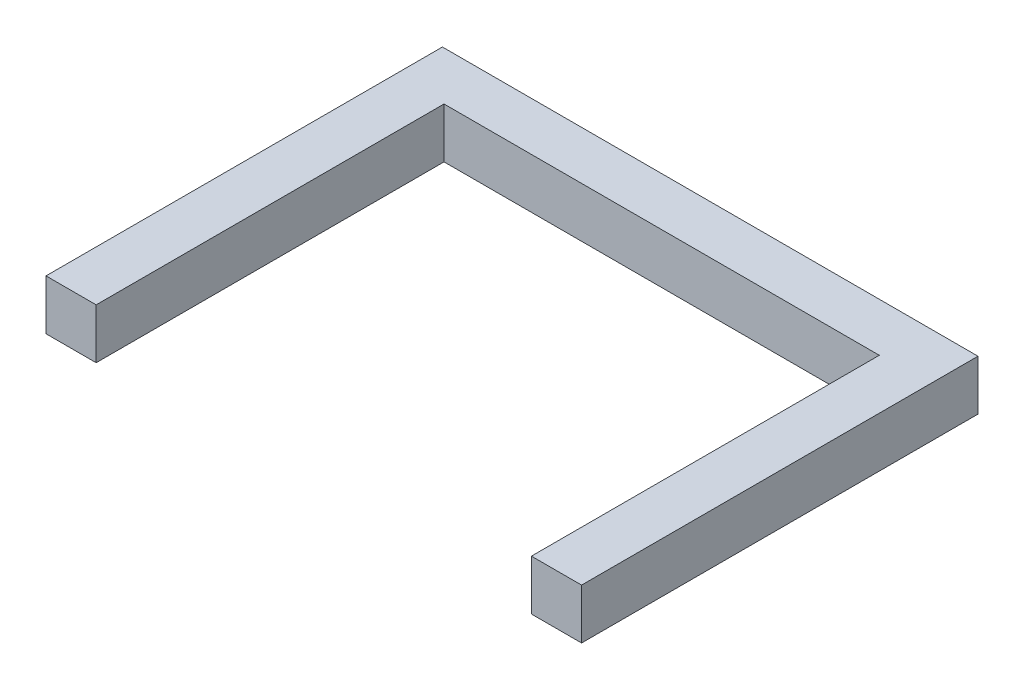
ISO-10303-21;
HEADER;
FILE_DESCRIPTION(('STEP AP214'),'2;1');
FILE_NAME('part.step','',(''),(''),'','','');
FILE_SCHEMA(('AUTOMOTIVE_DESIGN { 1 0 10303 214 1 1 1 1 }'));
ENDSEC;
DATA;
#1=APPLICATION_CONTEXT('core data for automotive mechanical design processes');
#2=APPLICATION_PROTOCOL_DEFINITION('international standard','automotive_design',2000,#1);
#3=PRODUCT_CONTEXT('',#1,'mechanical');
#4=PRODUCT('Part','Part','',(#3));
#5=PRODUCT_RELATED_PRODUCT_CATEGORY('part','',(#4));
#6=PRODUCT_DEFINITION_FORMATION('','',#4);
#7=PRODUCT_DEFINITION_CONTEXT('part definition',#1,'design');
#8=PRODUCT_DEFINITION('design','',#6,#7);
#9=PRODUCT_DEFINITION_SHAPE('','',#8);
#10=(LENGTH_UNIT() NAMED_UNIT(*) SI_UNIT(.MILLI.,.METRE.));
#11=(NAMED_UNIT(*) PLANE_ANGLE_UNIT() SI_UNIT($,.RADIAN.));
#12=(NAMED_UNIT(*) SI_UNIT($,.STERADIAN.) SOLID_ANGLE_UNIT());
#13=UNCERTAINTY_MEASURE_WITH_UNIT(LENGTH_MEASURE(1.E-05),#10,'distance_accuracy_value','');
#14=(GEOMETRIC_REPRESENTATION_CONTEXT(3) GLOBAL_UNCERTAINTY_ASSIGNED_CONTEXT((#13)) GLOBAL_UNIT_ASSIGNED_CONTEXT((#10,
#11,#12)) REPRESENTATION_CONTEXT('',''));
#15=CARTESIAN_POINT('',(0.,0.,0.));
#16=DIRECTION('',(0.,0.,1.));
#17=DIRECTION('',(1.,0.,0.));
#18=AXIS2_PLACEMENT_3D('',#15,#16,#17);
#19=CARTESIAN_POINT('',(3.1,3.1,0.));
#20=DIRECTION('',(0.,0.,-1.));
#21=DIRECTION('',(-1.,0.,0.));
#22=AXIS2_PLACEMENT_3D('',#19,#20,#21);
#23=PLANE('',#22);
#24=DIRECTION('',(1.,0.,0.));
#25=VECTOR('',#24,1.);
#26=CARTESIAN_POINT('',(3.1,0.,0.));
#27=LINE('',#26,#25);
#28=CARTESIAN_POINT('',(0.,0.,0.));
#29=VERTEX_POINT('',#28);
#30=CARTESIAN_POINT('',(3.1,0.,0.));
#31=VERTEX_POINT('',#30);
#32=EDGE_CURVE('E133',#29,#31,#27,.T.);
#33=ORIENTED_EDGE('',*,*,#32,.T.);
#34=DIRECTION('',(0.,-1.,0.));
#35=VECTOR('',#34,1.);
#36=CARTESIAN_POINT('',(3.1,3.1,0.));
#37=LINE('',#36,#35);
#38=CARTESIAN_POINT('',(3.1,3.1,0.));
#39=VERTEX_POINT('',#38);
#40=EDGE_CURVE('E11',#39,#31,#37,.T.);
#41=ORIENTED_EDGE('',*,*,#40,.F.);
#42=DIRECTION('',(1.,0.,0.));
#43=VECTOR('',#42,1.);
#44=CARTESIAN_POINT('',(3.1,3.1,0.));
#45=LINE('',#44,#43);
#46=CARTESIAN_POINT('',(0.,3.1,0.));
#47=VERTEX_POINT('',#46);
#48=EDGE_CURVE('E147',#47,#39,#45,.T.);
#49=ORIENTED_EDGE('',*,*,#48,.F.);
#50=DIRECTION('',(0.,-1.,0.));
#51=VECTOR('',#50,1.);
#52=CARTESIAN_POINT('',(0.,3.1,0.));
#53=LINE('',#52,#51);
#54=EDGE_CURVE('E129',#47,#29,#53,.T.);
#55=ORIENTED_EDGE('',*,*,#54,.T.);
#56=EDGE_LOOP('',(#33,#41,#49,#55));
#57=FACE_BOUND('',#56,.T.);
#58=ADVANCED_FACE('F37',(#57),#23,.F.);
#59=CARTESIAN_POINT('',(3.1,3.1,-21.5));
#60=DIRECTION('',(-1.,0.,0.));
#61=DIRECTION('',(0.,0.,1.));
#62=AXIS2_PLACEMENT_3D('',#59,#60,#61);
#63=PLANE('',#62);
#64=DIRECTION('',(0.,0.,-1.));
#65=VECTOR('',#64,1.);
#66=CARTESIAN_POINT('',(3.1,0.,-21.5));
#67=LINE('',#66,#65);
#68=CARTESIAN_POINT('',(3.1,0.,-21.5));
#69=VERTEX_POINT('',#68);
#70=EDGE_CURVE('E136',#31,#69,#67,.T.);
#71=ORIENTED_EDGE('',*,*,#70,.T.);
#72=DIRECTION('',(0.,-1.,0.));
#73=VECTOR('',#72,1.);
#74=CARTESIAN_POINT('',(3.1,3.1,-21.5));
#75=LINE('',#74,#73);
#76=CARTESIAN_POINT('',(3.1,3.1,-21.5));
#77=VERTEX_POINT('',#76);
#78=EDGE_CURVE('E45',#77,#69,#75,.T.);
#79=ORIENTED_EDGE('',*,*,#78,.F.);
#80=DIRECTION('',(0.,0.,-1.));
#81=VECTOR('',#80,1.);
#82=CARTESIAN_POINT('',(3.1,3.1,-21.5));
#83=LINE('',#82,#81);
#84=EDGE_CURVE('E96',#39,#77,#83,.T.);
#85=ORIENTED_EDGE('',*,*,#84,.F.);
#86=ORIENTED_EDGE('',*,*,#40,.T.);
#87=EDGE_LOOP('',(#71,#79,#85,#86));
#88=FACE_BOUND('',#87,.T.);
#89=ADVANCED_FACE('F182',(#88),#63,.F.);
#90=CARTESIAN_POINT('',(30.,3.1,-21.5));
#91=DIRECTION('',(0.,0.,-1.));
#92=DIRECTION('',(-1.,0.,0.));
#93=AXIS2_PLACEMENT_3D('',#90,#91,#92);
#94=PLANE('',#93);
#95=DIRECTION('',(1.,0.,0.));
#96=VECTOR('',#95,1.);
#97=CARTESIAN_POINT('',(30.,0.,-21.5));
#98=LINE('',#97,#96);
#99=CARTESIAN_POINT('',(30.,0.,-21.5));
#100=VERTEX_POINT('',#99);
#101=EDGE_CURVE('E138',#69,#100,#98,.T.);
#102=ORIENTED_EDGE('',*,*,#101,.T.);
#103=DIRECTION('',(0.,-1.,0.));
#104=VECTOR('',#103,1.);
#105=CARTESIAN_POINT('',(30.,3.1,-21.5));
#106=LINE('',#105,#104);
#107=CARTESIAN_POINT('',(30.,3.1,-21.5));
#108=VERTEX_POINT('',#107);
#109=EDGE_CURVE('E154',#108,#100,#106,.T.);
#110=ORIENTED_EDGE('',*,*,#109,.F.);
#111=DIRECTION('',(1.,0.,0.));
#112=VECTOR('',#111,1.);
#113=CARTESIAN_POINT('',(30.,3.1,-21.5));
#114=LINE('',#113,#112);
#115=EDGE_CURVE('E162',#77,#108,#114,.T.);
#116=ORIENTED_EDGE('',*,*,#115,.F.);
#117=ORIENTED_EDGE('',*,*,#78,.T.);
#118=EDGE_LOOP('',(#102,#110,#116,#117));
#119=FACE_BOUND('',#118,.T.);
#120=ADVANCED_FACE('F160',(#119),#94,.F.);
#121=CARTESIAN_POINT('',(30.,3.1,0.));
#122=DIRECTION('',(1.,0.,0.));
#123=DIRECTION('',(0.,0.,-1.));
#124=AXIS2_PLACEMENT_3D('',#121,#122,#123);
#125=PLANE('',#124);
#126=DIRECTION('',(0.,0.,1.));
#127=VECTOR('',#126,1.);
#128=CARTESIAN_POINT('',(30.,0.,0.));
#129=LINE('',#128,#127);
#130=CARTESIAN_POINT('',(30.,0.,0.));
#131=VERTEX_POINT('',#130);
#132=EDGE_CURVE('E140',#100,#131,#129,.T.);
#133=ORIENTED_EDGE('',*,*,#132,.T.);
#134=DIRECTION('',(0.,-1.,0.));
#135=VECTOR('',#134,1.);
#136=CARTESIAN_POINT('',(30.,3.1,0.));
#137=LINE('',#136,#135);
#138=CARTESIAN_POINT('',(30.,3.1,0.));
#139=VERTEX_POINT('',#138);
#140=EDGE_CURVE('E151',#139,#131,#137,.T.);
#141=ORIENTED_EDGE('',*,*,#140,.F.);
#142=DIRECTION('',(0.,0.,1.));
#143=VECTOR('',#142,1.);
#144=CARTESIAN_POINT('',(30.,3.1,0.));
#145=LINE('',#144,#143);
#146=EDGE_CURVE('E174',#108,#139,#145,.T.);
#147=ORIENTED_EDGE('',*,*,#146,.F.);
#148=ORIENTED_EDGE('',*,*,#109,.T.);
#149=EDGE_LOOP('',(#133,#141,#147,#148));
#150=FACE_BOUND('',#149,.T.);
#151=ADVANCED_FACE('F170',(#150),#125,.F.);
#152=CARTESIAN_POINT('',(33.1,3.1,0.));
#153=DIRECTION('',(0.,0.,-1.));
#154=DIRECTION('',(-1.,0.,0.));
#155=AXIS2_PLACEMENT_3D('',#152,#153,#154);
#156=PLANE('',#155);
#157=DIRECTION('',(1.,0.,0.));
#158=VECTOR('',#157,1.);
#159=CARTESIAN_POINT('',(33.1,0.,0.));
#160=LINE('',#159,#158);
#161=CARTESIAN_POINT('',(33.1,0.,0.));
#162=VERTEX_POINT('',#161);
#163=EDGE_CURVE('E142',#131,#162,#160,.T.);
#164=ORIENTED_EDGE('',*,*,#163,.T.);
#165=DIRECTION('',(0.,-1.,0.));
#166=VECTOR('',#165,1.);
#167=CARTESIAN_POINT('',(33.1,3.1,0.));
#168=LINE('',#167,#166);
#169=CARTESIAN_POINT('',(33.1,3.1,0.));
#170=VERTEX_POINT('',#169);
#171=EDGE_CURVE('E124',#170,#162,#168,.T.);
#172=ORIENTED_EDGE('',*,*,#171,.F.);
#173=DIRECTION('',(1.,0.,0.));
#174=VECTOR('',#173,1.);
#175=CARTESIAN_POINT('',(33.1,3.1,0.));
#176=LINE('',#175,#174);
#177=EDGE_CURVE('E115',#139,#170,#176,.T.);
#178=ORIENTED_EDGE('',*,*,#177,.F.);
#179=ORIENTED_EDGE('',*,*,#140,.T.);
#180=EDGE_LOOP('',(#164,#172,#178,#179));
#181=FACE_BOUND('',#180,.T.);
#182=ADVANCED_FACE('F173',(#181),#156,.F.);
#183=CARTESIAN_POINT('',(33.1,3.1,-24.5));
#184=DIRECTION('',(-1.,0.,0.));
#185=DIRECTION('',(0.,0.,1.));
#186=AXIS2_PLACEMENT_3D('',#183,#184,#185);
#187=PLANE('',#186);
#188=DIRECTION('',(0.,0.,-1.));
#189=VECTOR('',#188,1.);
#190=CARTESIAN_POINT('',(33.1,0.,-24.5));
#191=LINE('',#190,#189);
#192=CARTESIAN_POINT('',(33.1,0.,-24.5));
#193=VERTEX_POINT('',#192);
#194=EDGE_CURVE('E123',#162,#193,#191,.T.);
#195=ORIENTED_EDGE('',*,*,#194,.T.);
#196=DIRECTION('',(0.,-1.,0.));
#197=VECTOR('',#196,1.);
#198=CARTESIAN_POINT('',(33.1,3.1,-24.5));
#199=LINE('',#198,#197);
#200=CARTESIAN_POINT('',(33.1,3.1,-24.5));
#201=VERTEX_POINT('',#200);
#202=EDGE_CURVE('E120',#201,#193,#199,.T.);
#203=ORIENTED_EDGE('',*,*,#202,.F.);
#204=DIRECTION('',(0.,0.,-1.));
#205=VECTOR('',#204,1.);
#206=CARTESIAN_POINT('',(33.1,3.1,-24.5));
#207=LINE('',#206,#205);
#208=EDGE_CURVE('E109',#170,#201,#207,.T.);
#209=ORIENTED_EDGE('',*,*,#208,.F.);
#210=ORIENTED_EDGE('',*,*,#171,.T.);
#211=EDGE_LOOP('',(#195,#203,#209,#210));
#212=FACE_BOUND('',#211,.T.);
#213=ADVANCED_FACE('F121',(#212),#187,.F.);
#214=CARTESIAN_POINT('',(0.,3.1,-24.5));
#215=DIRECTION('',(0.,0.,1.));
#216=DIRECTION('',(1.,0.,0.));
#217=AXIS2_PLACEMENT_3D('',#214,#215,#216);
#218=PLANE('',#217);
#219=DIRECTION('',(-1.,0.,0.));
#220=VECTOR('',#219,1.);
#221=CARTESIAN_POINT('',(0.,0.,-24.5));
#222=LINE('',#221,#220);
#223=CARTESIAN_POINT('',(0.,0.,-24.5));
#224=VERTEX_POINT('',#223);
#225=EDGE_CURVE('E82',#193,#224,#222,.T.);
#226=ORIENTED_EDGE('',*,*,#225,.T.);
#227=DIRECTION('',(0.,-1.,0.));
#228=VECTOR('',#227,1.);
#229=CARTESIAN_POINT('',(0.,3.1,-24.5));
#230=LINE('',#229,#228);
#231=CARTESIAN_POINT('',(0.,3.1,-24.5));
#232=VERTEX_POINT('',#231);
#233=EDGE_CURVE('E125',#232,#224,#230,.T.);
#234=ORIENTED_EDGE('',*,*,#233,.F.);
#235=DIRECTION('',(-1.,0.,0.));
#236=VECTOR('',#235,1.);
#237=CARTESIAN_POINT('',(0.,3.1,-24.5));
#238=LINE('',#237,#236);
#239=EDGE_CURVE('E113',#201,#232,#238,.T.);
#240=ORIENTED_EDGE('',*,*,#239,.F.);
#241=ORIENTED_EDGE('',*,*,#202,.T.);
#242=EDGE_LOOP('',(#226,#234,#240,#241));
#243=FACE_BOUND('',#242,.T.);
#244=ADVANCED_FACE('F127',(#243),#218,.F.);
#245=CARTESIAN_POINT('',(0.,3.1,0.));
#246=DIRECTION('',(1.,0.,0.));
#247=DIRECTION('',(0.,0.,-1.));
#248=AXIS2_PLACEMENT_3D('',#245,#246,#247);
#249=PLANE('',#248);
#250=DIRECTION('',(0.,0.,1.));
#251=VECTOR('',#250,1.);
#252=CARTESIAN_POINT('',(0.,0.,0.));
#253=LINE('',#252,#251);
#254=EDGE_CURVE('E88',#224,#29,#253,.T.);
#255=ORIENTED_EDGE('',*,*,#254,.T.);
#256=ORIENTED_EDGE('',*,*,#54,.F.);
#257=DIRECTION('',(0.,0.,1.));
#258=VECTOR('',#257,1.);
#259=CARTESIAN_POINT('',(0.,3.1,0.));
#260=LINE('',#259,#258);
#261=EDGE_CURVE('E53',#232,#47,#260,.T.);
#262=ORIENTED_EDGE('',*,*,#261,.F.);
#263=ORIENTED_EDGE('',*,*,#233,.T.);
#264=EDGE_LOOP('',(#255,#256,#262,#263));
#265=FACE_BOUND('',#264,.T.);
#266=ADVANCED_FACE('F198',(#265),#249,.F.);
#267=CARTESIAN_POINT('',(0.,3.1,0.));
#268=DIRECTION('',(0.,-1.,0.));
#269=DIRECTION('',(0.,0.,-1.));
#270=AXIS2_PLACEMENT_3D('',#267,#268,#269);
#271=PLANE('',#270);
#272=ORIENTED_EDGE('',*,*,#48,.T.);
#273=ORIENTED_EDGE('',*,*,#84,.T.);
#274=ORIENTED_EDGE('',*,*,#115,.T.);
#275=ORIENTED_EDGE('',*,*,#146,.T.);
#276=ORIENTED_EDGE('',*,*,#177,.T.);
#277=ORIENTED_EDGE('',*,*,#208,.T.);
#278=ORIENTED_EDGE('',*,*,#239,.T.);
#279=ORIENTED_EDGE('',*,*,#261,.T.);
#280=EDGE_LOOP('',(#272,#273,#274,#275,#276,#277,#278,#279));
#281=FACE_BOUND('',#280,.T.);
#282=ADVANCED_FACE('F111',(#281),#271,.F.);
#283=CARTESIAN_POINT('',(0.,0.,0.));
#284=DIRECTION('',(0.,-1.,0.));
#285=DIRECTION('',(0.,0.,-1.));
#286=AXIS2_PLACEMENT_3D('',#283,#284,#285);
#287=PLANE('',#286);
#288=ORIENTED_EDGE('',*,*,#32,.F.);
#289=ORIENTED_EDGE('',*,*,#254,.F.);
#290=ORIENTED_EDGE('',*,*,#225,.F.);
#291=ORIENTED_EDGE('',*,*,#194,.F.);
#292=ORIENTED_EDGE('',*,*,#163,.F.);
#293=ORIENTED_EDGE('',*,*,#132,.F.);
#294=ORIENTED_EDGE('',*,*,#101,.F.);
#295=ORIENTED_EDGE('',*,*,#70,.F.);
#296=EDGE_LOOP('',(#288,#289,#290,#291,#292,#293,#294,#295));
#297=FACE_BOUND('',#296,.T.);
#298=ADVANCED_FACE('F166',(#297),#287,.T.);
#299=CLOSED_SHELL('',(#58,#89,#120,#151,#182,#213,#244,#266,#282,#298));
#300=MANIFOLD_SOLID_BREP('B2',#299);
#301=ADVANCED_BREP_SHAPE_REPRESENTATION('',(#18,#300),#14);
#302=SHAPE_DEFINITION_REPRESENTATION(#9,#301);
ENDSEC;
END-ISO-10303-21;
